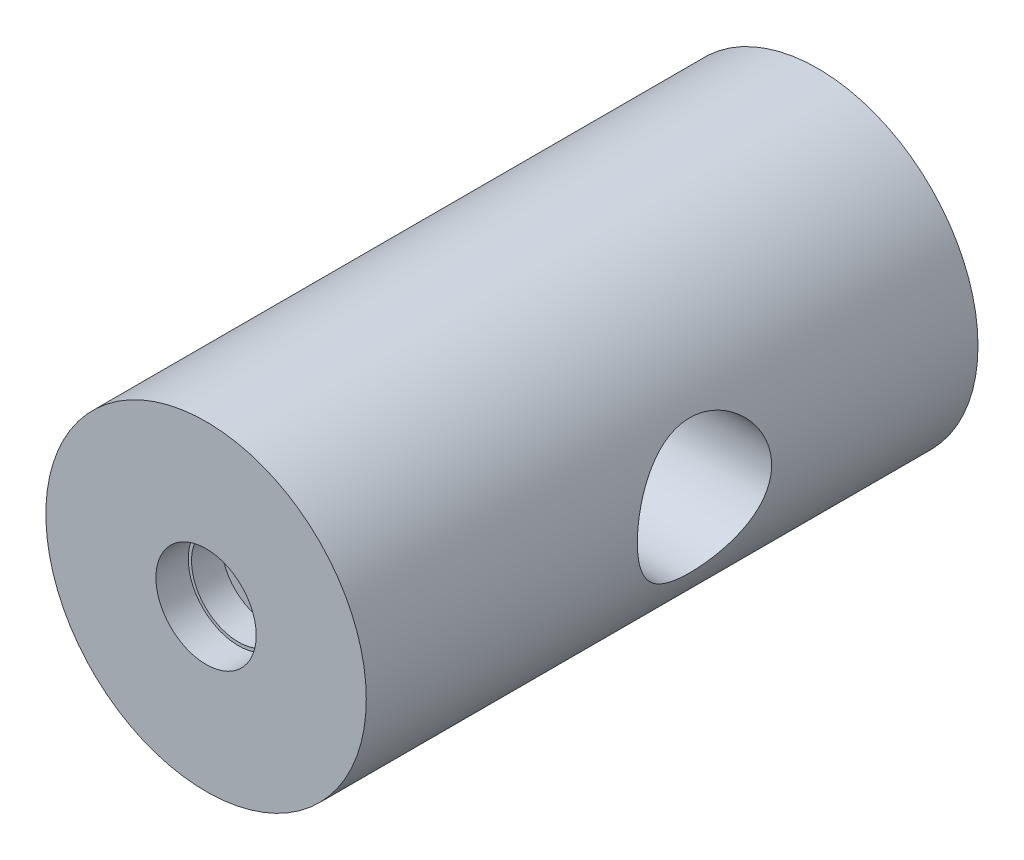
ISO-10303-21;
HEADER;
FILE_DESCRIPTION(('STEP AP214'),'2;1');
FILE_NAME('part.step','',(''),(''),'','','');
FILE_SCHEMA(('AUTOMOTIVE_DESIGN { 1 0 10303 214 1 1 1 1 }'));
ENDSEC;
DATA;
#1=APPLICATION_CONTEXT('core data for automotive mechanical design processes');
#2=APPLICATION_PROTOCOL_DEFINITION('international standard','automotive_design',2000,#1);
#3=PRODUCT_CONTEXT('',#1,'mechanical');
#4=PRODUCT('Part','Part','',(#3));
#5=PRODUCT_RELATED_PRODUCT_CATEGORY('part','',(#4));
#6=PRODUCT_DEFINITION_FORMATION('','',#4);
#7=PRODUCT_DEFINITION_CONTEXT('part definition',#1,'design');
#8=PRODUCT_DEFINITION('design','',#6,#7);
#9=PRODUCT_DEFINITION_SHAPE('','',#8);
#10=(LENGTH_UNIT() NAMED_UNIT(*) SI_UNIT(.MILLI.,.METRE.));
#11=(NAMED_UNIT(*) PLANE_ANGLE_UNIT() SI_UNIT($,.RADIAN.));
#12=(NAMED_UNIT(*) SI_UNIT($,.STERADIAN.) SOLID_ANGLE_UNIT());
#13=UNCERTAINTY_MEASURE_WITH_UNIT(LENGTH_MEASURE(1.E-05),#10,'distance_accuracy_value','');
#14=(GEOMETRIC_REPRESENTATION_CONTEXT(3) GLOBAL_UNCERTAINTY_ASSIGNED_CONTEXT((#13)) GLOBAL_UNIT_ASSIGNED_CONTEXT((#10,
#11,#12)) REPRESENTATION_CONTEXT('',''));
#15=CARTESIAN_POINT('',(0.,0.,0.));
#16=DIRECTION('',(0.,0.,1.));
#17=DIRECTION('',(1.,0.,0.));
#18=AXIS2_PLACEMENT_3D('',#15,#16,#17);
#19=CARTESIAN_POINT('',(0.,0.,29.8));
#20=DIRECTION('',(0.,0.,-1.));
#21=DIRECTION('',(-1.,0.,0.));
#22=AXIS2_PLACEMENT_3D('',#19,#20,#21);
#23=CYLINDRICAL_SURFACE('',#22,9.9);
#24=CARTESIAN_POINT('',(-9.9,0.,12.75));
#25=CARTESIAN_POINT('',(-9.89999936376863,0.111137703961855,12.7500008035311));
#26=CARTESIAN_POINT('',(-9.89812330404278,0.222312493642021,12.754470723063));
#27=CARTESIAN_POINT('',(-9.89066654053828,0.443868040869987,12.7723072014739));
#28=CARTESIAN_POINT('',(-9.88508351262446,0.554248256333967,12.7856793417377));
#29=CARTESIAN_POINT('',(-9.87034270889893,0.773582620903799,12.8212220269499));
#30=CARTESIAN_POINT('',(-9.86117766034859,0.882533399633642,12.8434104735789));
#31=CARTESIAN_POINT('',(-9.83951896356755,1.09801010128795,12.8963508538441));
#32=CARTESIAN_POINT('',(-9.82702395497839,1.20453501384682,12.9271062875066));
#33=CARTESIAN_POINT('',(-9.78510514707102,1.51855909051875,13.0315489067497));
#34=CARTESIAN_POINT('',(-9.75117611287902,1.72150643341442,13.1175769331328));
#35=CARTESIAN_POINT('',(-9.67461014365812,2.10978946162909,13.3195994434313));
#36=CARTESIAN_POINT('',(-9.63197578820685,2.29513034034601,13.4355850529492));
#37=CARTESIAN_POINT('',(-9.53984092867632,2.65274926107655,13.700437991587));
#38=CARTESIAN_POINT('',(-9.49011385120872,2.82402450112796,13.8505796045757));
#39=CARTESIAN_POINT('',(-9.39034773839318,3.13988111638779,14.1769140284446));
#40=CARTESIAN_POINT('',(-9.34030855150487,3.28444827800387,14.3531206213688));
#41=CARTESIAN_POINT('',(-9.26781448340973,3.48179189572314,14.6385959004717));
#42=CARTESIAN_POINT('',(-9.24353570439206,3.54557708556255,14.7399611234836));
#43=CARTESIAN_POINT('',(-9.19710855039205,3.66432162895562,14.9481827821323));
#44=CARTESIAN_POINT('',(-9.17495930812479,3.7192845816522,15.0550369548775));
#45=CARTESIAN_POINT('',(-9.13352324057704,3.81991078551445,15.2735752510797));
#46=CARTESIAN_POINT('',(-9.11423652117129,3.86557369272711,15.3852595529892));
#47=CARTESIAN_POINT('',(-9.07921906414395,3.94711943240492,15.6126294319046));
#48=CARTESIAN_POINT('',(-9.063486491741,3.98300731307548,15.72831290866));
#49=CARTESIAN_POINT('',(-9.03681927940762,4.04313332439531,15.9571894142507));
#50=CARTESIAN_POINT('',(-9.02569015532342,4.0678490336294,16.0702343170837));
#51=CARTESIAN_POINT('',(-9.00758955656416,4.10777466348236,16.2982709508497));
#52=CARTESIAN_POINT('',(-9.00061615358382,4.12298899301464,16.4132617533485));
#53=CARTESIAN_POINT('',(-8.99108372103437,4.14373560752424,16.6442664424728));
#54=CARTESIAN_POINT('',(-8.98852351940748,4.14927046318138,16.7602800492327));
#55=CARTESIAN_POINT('',(-8.98791222396132,4.15059447358503,16.9923698566112));
#56=CARTESIAN_POINT('',(-8.98986088842473,4.14638415076408,17.1084460535408));
#57=CARTESIAN_POINT('',(-8.99786711744624,4.1289794026888,17.3306474109071));
#58=CARTESIAN_POINT('',(-9.00359203187312,4.11651200898724,17.4368419891025));
#59=CARTESIAN_POINT('',(-9.01861910903411,4.0834822341996,17.6477180224297));
#60=CARTESIAN_POINT('',(-9.02792244041163,4.06291720852776,17.7523989716385));
#61=CARTESIAN_POINT('',(-9.06079367522316,3.98935906912969,18.0630561402822));
#62=CARTESIAN_POINT('',(-9.08933016326327,3.92448818062487,18.2658298230904));
#63=CARTESIAN_POINT('',(-9.15708730335573,3.76370078915723,18.6617530716921));
#64=CARTESIAN_POINT('',(-9.19652353854096,3.66714958667136,18.8546037986563));
#65=CARTESIAN_POINT('',(-9.28158889766754,3.44617317987444,19.2221518906887));
#66=CARTESIAN_POINT('',(-9.32722047761662,3.32173690835158,19.3968420076433));
#67=CARTESIAN_POINT('',(-9.42428807223253,3.03602000225575,19.7388173876313));
#68=CARTESIAN_POINT('',(-9.47588651109946,2.87249668888246,19.9041873589521));
#69=CARTESIAN_POINT('',(-9.5757806460006,2.51953247711901,20.2058064187901));
#70=CARTESIAN_POINT('',(-9.62407554771284,2.33008537808745,20.3420485202518));
#71=CARTESIAN_POINT('',(-9.71335444507636,1.92477321640077,20.5843956816636));
#72=CARTESIAN_POINT('',(-9.75413881402709,1.70838985634246,20.6897128978233));
#73=CARTESIAN_POINT('',(-9.82226542388113,1.25883060581747,20.8617774632507));
#74=CARTESIAN_POINT('',(-9.8496151852428,1.02566419421865,20.9285463948526));
#75=CARTESIAN_POINT('',(-9.88638084332872,0.56514987525805,21.0175906009642));
#76=CARTESIAN_POINT('',(-9.89683037211846,0.338381125603339,21.0424347272065));
#77=CARTESIAN_POINT('',(-9.9019242220063,-0.116307819693139,21.0545938655225));
#78=CARTESIAN_POINT('',(-9.89657315114652,-0.344227660280251,21.041919819287));
#79=CARTESIAN_POINT('',(-9.87133634996601,-0.78265923574304,20.9812335866085));
#80=CARTESIAN_POINT('',(-9.85219620628951,-0.993469590094815,20.9350332938313));
#81=CARTESIAN_POINT('',(-9.80210617940928,-1.40411205469761,20.8111357366801));
#82=CARTESIAN_POINT('',(-9.77115480871942,-1.60394277856468,20.7334345050536));
#83=CARTESIAN_POINT('',(-9.69920828576771,-1.99397325594313,20.5462075537138));
#84=CARTESIAN_POINT('',(-9.65793061664588,-2.18367995871516,20.4357669408619));
#85=CARTESIAN_POINT('',(-9.5697248575726,-2.54255162791106,20.187189530803));
#86=CARTESIAN_POINT('',(-9.52279439951565,-2.71170792519428,20.0490411098167));
#87=CARTESIAN_POINT('',(-9.42414598755407,-3.03751747432849,19.7373316035958));
#88=CARTESIAN_POINT('',(-9.37232720704453,-3.19238270766228,19.5619324000595));
#89=CARTESIAN_POINT('',(-9.27274790681631,-3.47103788966408,19.1866861854376));
#90=CARTESIAN_POINT('',(-9.22498835252473,-3.59482045938435,18.9868333858446));
#91=CARTESIAN_POINT('',(-9.16038285117577,-3.75509902997386,18.6708808227953));
#92=CARTESIAN_POINT('',(-9.13988633545232,-3.80458088786905,18.5619380932541));
#93=CARTESIAN_POINT('',(-9.10210570979698,-3.8941025204541,18.3397185282604));
#94=CARTESIAN_POINT('',(-9.08482018391276,-3.93414645909332,18.2264436298678));
#95=CARTESIAN_POINT('',(-9.05409614377175,-4.00434927089742,17.996423585491));
#96=CARTESIAN_POINT('',(-9.04065581944121,-4.03451279609837,17.8796801009581));
#97=CARTESIAN_POINT('',(-9.01812925607071,-4.08461779769234,17.643606991222));
#98=CARTESIAN_POINT('',(-9.0090426004179,-4.10456025217656,17.5242776146115));
#99=CARTESIAN_POINT('',(-8.99611391588451,-4.13281437444869,17.293439337819));
#100=CARTESIAN_POINT('',(-8.99191832926178,-4.14191137957702,17.1820457642068));
#101=CARTESIAN_POINT('',(-8.98768553066504,-4.15108838198007,16.9587693710159));
#102=CARTESIAN_POINT('',(-8.98764970988141,-4.15116536260159,16.8468864002736));
#103=CARTESIAN_POINT('',(-8.99174328753819,-4.1422915427831,16.6236100824451));
#104=CARTESIAN_POINT('',(-8.99587048063969,-4.13334552223979,16.5122165074838));
#105=CARTESIAN_POINT('',(-9.00813306920598,-4.10654866232301,16.290715870196));
#106=CARTESIAN_POINT('',(-9.01626997536347,-4.08869446668885,16.1806093087812));
#107=CARTESIAN_POINT('',(-9.04534745945391,-4.02416855074486,15.8639828562347));
#108=CARTESIAN_POINT('',(-9.07121594656557,-3.96603108540419,15.6601239220676));
#109=CARTESIAN_POINT('',(-9.13356726628056,-3.82023041436249,15.2651357551367));
#110=CARTESIAN_POINT('',(-9.17005308850471,-3.7325588913873,15.0740101264609));
#111=CARTESIAN_POINT('',(-9.25226158677317,-3.52404918447954,14.6971197355741));
#112=CARTESIAN_POINT('',(-9.29840971024954,-3.40152454522612,14.5123798486438));
#113=CARTESIAN_POINT('',(-9.39356616502039,-3.12917510236536,14.1651244538166));
#114=CARTESIAN_POINT('',(-9.44257550316371,-2.97934064871501,14.0026168374364));
#115=CARTESIAN_POINT('',(-9.54231751439895,-2.64328981720729,13.6919530301101));
#116=CARTESIAN_POINT('',(-9.59290880572471,-2.45520030266615,13.5457524389309));
#117=CARTESIAN_POINT('',(-9.66303246643307,-2.15555513434042,13.3517160964985));
#118=CARTESIAN_POINT('',(-9.68546252645347,-2.05266317941709,13.2912087748325));
#119=CARTESIAN_POINT('',(-9.72778786872433,-1.84165436299105,13.1791056315617));
#120=CARTESIAN_POINT('',(-9.74768431937099,-1.73353994183554,13.1275056983038));
#121=CARTESIAN_POINT('',(-9.78408504647997,-1.51453460923357,13.034430736803));
#122=CARTESIAN_POINT('',(-9.80063750375299,-1.40371355473514,12.9928099951081));
#123=CARTESIAN_POINT('',(-9.83025548206077,-1.17854138787132,12.9191002856221));
#124=CARTESIAN_POINT('',(-9.84332265904065,-1.06419198083264,12.8870067903726));
#125=CARTESIAN_POINT('',(-9.86556624445071,-0.833095117524291,12.8327517686785));
#126=CARTESIAN_POINT('',(-9.87475223227463,-0.716354319971054,12.8105657811198));
#127=CARTESIAN_POINT('',(-9.88899838513333,-0.481210524491665,12.7762838815714));
#128=CARTESIAN_POINT('',(-9.89406156409536,-0.36280880529021,12.7641805985985));
#129=CARTESIAN_POINT('',(-9.89799262362366,-0.203468410002861,12.754790701385));
#130=CARTESIAN_POINT('',(-9.89874496694733,-0.162800798814473,12.7529946946562));
#131=CARTESIAN_POINT('',(-9.8997487725532,-0.0814237842268527,12.7505991946813));
#132=CARTESIAN_POINT('',(-9.90000023307812,-0.0407143806814991,12.749999705633));
#133=CARTESIAN_POINT('',(-9.9,0.,12.75));
#134=B_SPLINE_CURVE_WITH_KNOTS('',3,(#24,#25,#26,#27,#28,#29,#30,#31,#32,#33,#34,#35,#36,#37,
#38,#39,#40,#41,#42,#43,#44,#45,#46,#47,#48,#49,#50,#51,#52,#53,#54,#55,#56,#57,#58,#59,#60,#61,
#62,#63,#64,#65,#66,#67,#68,#69,#70,#71,#72,#73,#74,#75,#76,#77,#78,#79,#80,#81,#82,#83,#84,#85,
#86,#87,#88,#89,#90,#91,#92,#93,#94,#95,#96,#97,#98,#99,#100,#101,#102,#103,#104,#105,#106,#107,
#108,#109,#110,#111,#112,#113,#114,#115,#116,#117,#118,#119,#120,#121,#122,#123,#124,#125,#126,
#127,#128,#129,#130,#131,#132,#133),.UNSPECIFIED.,.T.,.F.,(4,2,2,2,2,2,2,2,2,2,2,2,2,2,2,2,2,2,
2,2,2,2,2,2,2,2,2,2,2,2,2,2,2,2,2,2,2,2,2,2,2,2,2,2,2,2,2,2,2,2,2,2,2,2,4),(0.,
0.333371521871553,0.666952253259356,1.00121381684168,1.33561214315506,2.00140288954413,
2.66699663310014,3.36342232235007,4.06021757672445,4.42643531414003,4.79250326658461,
5.1585847552345,5.52447682509167,5.87275805062309,6.22087754333157,6.56890456823175,
6.91691293606631,7.23775297374102,7.55869788080057,8.20004288827763,8.8551133968667,
9.51044435611841,10.2218965610642,10.9335192347933,11.6619503738501,12.3899732838897,
13.0715091618965,13.7528462983431,14.3998690282261,15.0469732699739,15.714209765283,
16.3817267625169,17.0975019755126,17.8134469514746,18.1772335154026,18.5408592773258,
18.9043135849033,19.2677331057279,19.6028286844142,19.9380363320051,20.2730664979806,
20.6082229859723,21.2458303770357,21.8836174790967,22.560012530966,23.2366470549971,
23.9634177448462,24.3274016564359,24.6912171010398,25.0493432510781,25.4072989419561,
25.7643659057268,26.1211716052708,26.2432990826896,26.3654269885757),.UNSPECIFIED.);
#135=CARTESIAN_POINT('',(-9.9,0.,12.75));
#136=VERTEX_POINT('',#135);
#137=EDGE_CURVE('E10',#136,#136,#134,.T.);
#138=ORIENTED_EDGE('',*,*,#137,.T.);
#139=EDGE_LOOP('',(#138));
#140=FACE_BOUND('',#139,.T.);
#141=CARTESIAN_POINT('',(9.89999999999999,0.,12.75));
#142=CARTESIAN_POINT('',(9.89999936376861,-0.111137703961856,12.7500008035311));
#143=CARTESIAN_POINT('',(9.89812330404277,-0.222312493642022,12.754470723063));
#144=CARTESIAN_POINT('',(9.89066654053828,-0.443868040869988,12.7723072014739));
#145=CARTESIAN_POINT('',(9.88508351262446,-0.554248256333968,12.7856793417377));
#146=CARTESIAN_POINT('',(9.87034270889893,-0.7735826209038,12.8212220269499));
#147=CARTESIAN_POINT('',(9.86117766034859,-0.882533399633644,12.8434104735789));
#148=CARTESIAN_POINT('',(9.83951896356755,-1.09801010128795,12.8963508538441));
#149=CARTESIAN_POINT('',(9.82702395497839,-1.20453501384682,12.9271062875066));
#150=CARTESIAN_POINT('',(9.78510514707102,-1.51855909051875,13.0315489067497));
#151=CARTESIAN_POINT('',(9.75117611287902,-1.72150643341443,13.1175769331328));
#152=CARTESIAN_POINT('',(9.67461014365812,-2.10978946162909,13.3195994434313));
#153=CARTESIAN_POINT('',(9.63197578820685,-2.29513034034601,13.4355850529492));
#154=CARTESIAN_POINT('',(9.53984092867632,-2.65274926107655,13.700437991587));
#155=CARTESIAN_POINT('',(9.49011385120871,-2.82402450112797,13.8505796045757));
#156=CARTESIAN_POINT('',(9.39034773839317,-3.13988111638779,14.1769140284447));
#157=CARTESIAN_POINT('',(9.34030855150487,-3.28444827800387,14.3531206213688));
#158=CARTESIAN_POINT('',(9.26781448340973,-3.48179189572314,14.6385959004717));
#159=CARTESIAN_POINT('',(9.24353570439206,-3.54557708556255,14.7399611234836));
#160=CARTESIAN_POINT('',(9.19710855039205,-3.66432162895563,14.9481827821323));
#161=CARTESIAN_POINT('',(9.17495930812479,-3.7192845816522,15.0550369548775));
#162=CARTESIAN_POINT('',(9.13352324057704,-3.81991078551446,15.2735752510797));
#163=CARTESIAN_POINT('',(9.11423652117128,-3.86557369272711,15.3852595529892));
#164=CARTESIAN_POINT('',(9.07921906414395,-3.94711943240492,15.6126294319046));
#165=CARTESIAN_POINT('',(9.063486491741,-3.98300731307548,15.72831290866));
#166=CARTESIAN_POINT('',(9.03681927940762,-4.04313332439531,15.9571894142507));
#167=CARTESIAN_POINT('',(9.02569015532341,-4.0678490336294,16.0702343170837));
#168=CARTESIAN_POINT('',(9.00758955656416,-4.10777466348236,16.2982709508497));
#169=CARTESIAN_POINT('',(9.00061615358382,-4.12298899301464,16.4132617533485));
#170=CARTESIAN_POINT('',(8.99108372103437,-4.14373560752424,16.6442664424728));
#171=CARTESIAN_POINT('',(8.98852351940748,-4.14927046318138,16.7602800492327));
#172=CARTESIAN_POINT('',(8.98791222396132,-4.15059447358503,16.9923698566112));
#173=CARTESIAN_POINT('',(8.98986088842473,-4.14638415076408,17.1084460535408));
#174=CARTESIAN_POINT('',(8.99786711744624,-4.1289794026888,17.3306474109071));
#175=CARTESIAN_POINT('',(9.00359203187312,-4.11651200898724,17.4368419891025));
#176=CARTESIAN_POINT('',(9.01861910903411,-4.0834822341996,17.6477180224297));
#177=CARTESIAN_POINT('',(9.02792244041163,-4.06291720852776,17.7523989716385));
#178=CARTESIAN_POINT('',(9.06079367522316,-3.98935906912969,18.0630561402822));
#179=CARTESIAN_POINT('',(9.08933016326327,-3.92448818062488,18.2658298230904));
#180=CARTESIAN_POINT('',(9.15708730335573,-3.76370078915723,18.6617530716921));
#181=CARTESIAN_POINT('',(9.19652353854096,-3.66714958667136,18.8546037986563));
#182=CARTESIAN_POINT('',(9.28158889766754,-3.44617317987444,19.2221518906887));
#183=CARTESIAN_POINT('',(9.32722047761662,-3.32173690835158,19.3968420076433));
#184=CARTESIAN_POINT('',(9.42428807223253,-3.03602000225575,19.7388173876313));
#185=CARTESIAN_POINT('',(9.47588651109946,-2.87249668888246,19.9041873589521));
#186=CARTESIAN_POINT('',(9.5757806460006,-2.51953247711901,20.2058064187901));
#187=CARTESIAN_POINT('',(9.62407554771284,-2.33008537808745,20.3420485202518));
#188=CARTESIAN_POINT('',(9.71335444507636,-1.92477321640077,20.5843956816636));
#189=CARTESIAN_POINT('',(9.75413881402709,-1.70838985634246,20.6897128978233));
#190=CARTESIAN_POINT('',(9.82226542388113,-1.25883060581747,20.8617774632507));
#191=CARTESIAN_POINT('',(9.8496151852428,-1.02566419421864,20.9285463948526));
#192=CARTESIAN_POINT('',(9.88638084332872,-0.565149875258049,21.0175906009642));
#193=CARTESIAN_POINT('',(9.89683037211846,-0.338381125603338,21.0424347272065));
#194=CARTESIAN_POINT('',(9.9019242220063,0.116307819693141,21.0545938655225));
#195=CARTESIAN_POINT('',(9.89657315114652,0.344227660280253,21.041919819287));
#196=CARTESIAN_POINT('',(9.87133634996601,0.782659235743042,20.9812335866085));
#197=CARTESIAN_POINT('',(9.85219620628951,0.993469590094818,20.9350332938313));
#198=CARTESIAN_POINT('',(9.80210617940928,1.40411205469761,20.8111357366801));
#199=CARTESIAN_POINT('',(9.77115480871942,1.60394277856468,20.7334345050536));
#200=CARTESIAN_POINT('',(9.69920828576771,1.99397325594313,20.5462075537138));
#201=CARTESIAN_POINT('',(9.65793061664588,2.18367995871516,20.4357669408619));
#202=CARTESIAN_POINT('',(9.5697248575726,2.54255162791107,20.187189530803));
#203=CARTESIAN_POINT('',(9.52279439951565,2.71170792519428,20.0490411098167));
#204=CARTESIAN_POINT('',(9.42414598755407,3.03751747432849,19.7373316035958));
#205=CARTESIAN_POINT('',(9.37232720704453,3.19238270766228,19.5619324000595));
#206=CARTESIAN_POINT('',(9.27274790681631,3.47103788966408,19.1866861854376));
#207=CARTESIAN_POINT('',(9.22498835252473,3.59482045938436,18.9868333858446));
#208=CARTESIAN_POINT('',(9.16038285117577,3.75509902997386,18.6708808227953));
#209=CARTESIAN_POINT('',(9.13988633545232,3.80458088786905,18.5619380932541));
#210=CARTESIAN_POINT('',(9.10210570979698,3.8941025204541,18.3397185282604));
#211=CARTESIAN_POINT('',(9.08482018391276,3.93414645909332,18.2264436298678));
#212=CARTESIAN_POINT('',(9.05409614377175,4.00434927089742,17.996423585491));
#213=CARTESIAN_POINT('',(9.0406558194412,4.03451279609837,17.8796801009581));
#214=CARTESIAN_POINT('',(9.01812925607071,4.08461779769234,17.643606991222));
#215=CARTESIAN_POINT('',(9.0090426004179,4.10456025217656,17.5242776146115));
#216=CARTESIAN_POINT('',(8.99611391588451,4.13281437444869,17.293439337819));
#217=CARTESIAN_POINT('',(8.99191832926178,4.14191137957702,17.1820457642068));
#218=CARTESIAN_POINT('',(8.98768553066504,4.15108838198007,16.9587693710159));
#219=CARTESIAN_POINT('',(8.98764970988141,4.15116536260159,16.8468864002736));
#220=CARTESIAN_POINT('',(8.99174328753819,4.1422915427831,16.6236100824451));
#221=CARTESIAN_POINT('',(8.99587048063969,4.13334552223979,16.5122165074838));
#222=CARTESIAN_POINT('',(9.00813306920598,4.10654866232301,16.290715870196));
#223=CARTESIAN_POINT('',(9.01626997536347,4.08869446668884,16.1806093087812));
#224=CARTESIAN_POINT('',(9.04534745945391,4.02416855074486,15.8639828562347));
#225=CARTESIAN_POINT('',(9.07121594656557,3.96603108540419,15.6601239220676));
#226=CARTESIAN_POINT('',(9.13356726628056,3.82023041436249,15.2651357551367));
#227=CARTESIAN_POINT('',(9.17005308850471,3.7325588913873,15.0740101264609));
#228=CARTESIAN_POINT('',(9.25226158677317,3.52404918447954,14.6971197355741));
#229=CARTESIAN_POINT('',(9.29840971024954,3.40152454522612,14.5123798486438));
#230=CARTESIAN_POINT('',(9.39356616502039,3.12917510236536,14.1651244538165));
#231=CARTESIAN_POINT('',(9.44257550316371,2.979340648715,14.0026168374364));
#232=CARTESIAN_POINT('',(9.54231751439895,2.64328981720729,13.6919530301101));
#233=CARTESIAN_POINT('',(9.59290880572471,2.45520030266614,13.5457524389308));
#234=CARTESIAN_POINT('',(9.66303246643307,2.15555513434041,13.3517160964985));
#235=CARTESIAN_POINT('',(9.68546252645347,2.05266317941708,13.2912087748325));
#236=CARTESIAN_POINT('',(9.72778786872433,1.84165436299104,13.1791056315617));
#237=CARTESIAN_POINT('',(9.74768431937099,1.73353994183553,13.1275056983038));
#238=CARTESIAN_POINT('',(9.78408504647997,1.51453460923357,13.034430736803));
#239=CARTESIAN_POINT('',(9.80063750375299,1.40371355473514,12.9928099951081));
#240=CARTESIAN_POINT('',(9.83025548206077,1.17854138787131,12.9191002856221));
#241=CARTESIAN_POINT('',(9.84332265904065,1.06419198083264,12.8870067903726));
#242=CARTESIAN_POINT('',(9.86556624445071,0.833095117524287,12.8327517686785));
#243=CARTESIAN_POINT('',(9.87475223227463,0.71635431997105,12.8105657811198));
#244=CARTESIAN_POINT('',(9.88899838513333,0.481210524491663,12.7762838815714));
#245=CARTESIAN_POINT('',(9.89406156409536,0.362808805290207,12.7641805985985));
#246=CARTESIAN_POINT('',(9.89799262362366,0.203468410002857,12.754790701385));
#247=CARTESIAN_POINT('',(9.89874496694733,0.162800798814469,12.7529946946562));
#248=CARTESIAN_POINT('',(9.8997487725532,0.0814237842268505,12.7505991946813));
#249=CARTESIAN_POINT('',(9.90000023307811,0.040714380681498,12.749999705633));
#250=CARTESIAN_POINT('',(9.89999999999999,0.,12.75));
#251=B_SPLINE_CURVE_WITH_KNOTS('',3,(#141,#142,#143,#144,#145,#146,#147,#148,#149,#150,#151,
#152,#153,#154,#155,#156,#157,#158,#159,#160,#161,#162,#163,#164,#165,#166,#167,#168,#169,#170,
#171,#172,#173,#174,#175,#176,#177,#178,#179,#180,#181,#182,#183,#184,#185,#186,#187,#188,#189,
#190,#191,#192,#193,#194,#195,#196,#197,#198,#199,#200,#201,#202,#203,#204,#205,#206,#207,#208,
#209,#210,#211,#212,#213,#214,#215,#216,#217,#218,#219,#220,#221,#222,#223,#224,#225,#226,#227,
#228,#229,#230,#231,#232,#233,#234,#235,#236,#237,#238,#239,#240,#241,#242,#243,#244,#245,#246,
#247,#248,#249,#250),.UNSPECIFIED.,.T.,.F.,(4,2,2,2,2,2,2,2,2,2,2,2,2,2,2,2,2,2,2,2,2,2,2,2,2,2,
2,2,2,2,2,2,2,2,2,2,2,2,2,2,2,2,2,2,2,2,2,2,2,2,2,2,2,2,4),(0.,0.333371521871554,
0.666952253259358,1.00121381684169,1.33561214315506,2.00140288954413,2.66699663310014,
3.36342232235007,4.06021757672445,4.42643531414004,4.79250326658462,5.1585847552345,
5.52447682509167,5.87275805062309,6.22087754333157,6.56890456823175,6.91691293606632,
7.23775297374102,7.55869788080057,8.20004288827764,8.8551133968667,9.51044435611841,
10.2218965610642,10.9335192347933,11.6619503738501,12.3899732838897,13.0715091618965,
13.7528462983431,14.3998690282261,15.0469732699739,15.714209765283,16.3817267625169,
17.0975019755126,17.8134469514746,18.1772335154026,18.5408592773258,18.9043135849033,
19.2677331057279,19.6028286844142,19.9380363320052,20.2730664979806,20.6082229859723,
21.2458303770357,21.8836174790967,22.560012530966,23.2366470549971,23.9634177448462,
24.3274016564359,24.6912171010398,25.0493432510781,25.4072989419561,25.7643659057268,
26.1211716052708,26.2432990826896,26.3654269885757),.UNSPECIFIED.);
#252=CARTESIAN_POINT('',(9.89999999999999,0.,12.75));
#253=VERTEX_POINT('',#252);
#254=EDGE_CURVE('E46',#253,#253,#251,.T.);
#255=ORIENTED_EDGE('',*,*,#254,.T.);
#256=EDGE_LOOP('',(#255));
#257=FACE_BOUND('',#256,.T.);
#258=CARTESIAN_POINT('',(0.,0.,0.));
#259=DIRECTION('',(0.,0.,1.));
#260=DIRECTION('',(1.,0.,0.));
#261=AXIS2_PLACEMENT_3D('',#258,#259,#260);
#262=CIRCLE('',#261,9.9);
#263=CARTESIAN_POINT('',(9.9,0.,0.));
#264=VERTEX_POINT('',#263);
#265=EDGE_CURVE('E50',#264,#264,#262,.T.);
#266=ORIENTED_EDGE('',*,*,#265,.T.);
#267=EDGE_LOOP('',(#266));
#268=FACE_BOUND('',#267,.T.);
#269=CARTESIAN_POINT('',(0.,0.,37.8));
#270=DIRECTION('',(0.,0.,1.));
#271=DIRECTION('',(1.,0.,0.));
#272=AXIS2_PLACEMENT_3D('',#269,#270,#271);
#273=CIRCLE('',#272,9.9);
#274=CARTESIAN_POINT('',(9.9,0.,37.8));
#275=VERTEX_POINT('',#274);
#276=EDGE_CURVE('E54',#275,#275,#273,.T.);
#277=ORIENTED_EDGE('',*,*,#276,.F.);
#278=EDGE_LOOP('',(#277));
#279=FACE_BOUND('',#278,.T.);
#280=ADVANCED_FACE('F35',(#140,#257,#268,#279),#23,.T.);
#281=CARTESIAN_POINT('',(0.,0.,0.));
#282=DIRECTION('',(0.,0.,1.));
#283=DIRECTION('',(1.,0.,0.));
#284=AXIS2_PLACEMENT_3D('',#281,#282,#283);
#285=PLANE('',#284);
#286=ORIENTED_EDGE('',*,*,#265,.F.);
#287=EDGE_LOOP('',(#286));
#288=FACE_BOUND('',#287,.T.);
#289=ADVANCED_FACE('F65',(#288),#285,.F.);
#290=CARTESIAN_POINT('',(-9.9,0.,16.9));
#291=DIRECTION('',(1.,0.,0.));
#292=DIRECTION('',(0.,0.,-1.));
#293=AXIS2_PLACEMENT_3D('',#290,#291,#292);
#294=CYLINDRICAL_SURFACE('',#293,4.15);
#295=ORIENTED_EDGE('',*,*,#254,.F.);
#296=EDGE_LOOP('',(#295));
#297=FACE_BOUND('',#296,.T.);
#298=ORIENTED_EDGE('',*,*,#137,.F.);
#299=EDGE_LOOP('',(#298));
#300=FACE_BOUND('',#299,.T.);
#301=ADVANCED_FACE('F60',(#297,#300),#294,.F.);
#302=CARTESIAN_POINT('',(0.,0.,37.8));
#303=DIRECTION('',(0.,0.,1.));
#304=DIRECTION('',(1.,0.,0.));
#305=AXIS2_PLACEMENT_3D('',#302,#303,#304);
#306=PLANE('',#305);
#307=CARTESIAN_POINT('',(0.,0.,37.8));
#308=DIRECTION('',(0.,0.,1.));
#309=DIRECTION('',(1.,0.,0.));
#310=AXIS2_PLACEMENT_3D('',#307,#308,#309);
#311=CIRCLE('',#310,3.1);
#312=CARTESIAN_POINT('',(3.1,0.,37.8));
#313=VERTEX_POINT('',#312);
#314=EDGE_CURVE('E82',#313,#313,#311,.T.);
#315=ORIENTED_EDGE('',*,*,#314,.F.);
#316=EDGE_LOOP('',(#315));
#317=FACE_BOUND('',#316,.T.);
#318=ORIENTED_EDGE('',*,*,#276,.T.);
#319=EDGE_LOOP('',(#318));
#320=FACE_BOUND('',#319,.T.);
#321=ADVANCED_FACE('F64',(#317,#320),#306,.T.);
#322=CARTESIAN_POINT('',(0.,0.,35.8));
#323=DIRECTION('',(0.,0.,1.));
#324=DIRECTION('',(1.,0.,0.));
#325=AXIS2_PLACEMENT_3D('',#322,#323,#324);
#326=CYLINDRICAL_SURFACE('',#325,3.1);
#327=CARTESIAN_POINT('',(0.,0.,35.8));
#328=DIRECTION('',(0.,0.,1.));
#329=DIRECTION('',(1.,0.,0.));
#330=AXIS2_PLACEMENT_3D('',#327,#328,#329);
#331=CIRCLE('',#330,3.1);
#332=CARTESIAN_POINT('',(3.1,0.,35.8));
#333=VERTEX_POINT('',#332);
#334=EDGE_CURVE('E80',#333,#333,#331,.T.);
#335=ORIENTED_EDGE('',*,*,#334,.F.);
#336=EDGE_LOOP('',(#335));
#337=FACE_BOUND('',#336,.T.);
#338=ORIENTED_EDGE('',*,*,#314,.T.);
#339=EDGE_LOOP('',(#338));
#340=FACE_BOUND('',#339,.T.);
#341=ADVANCED_FACE('F123',(#337,#340),#326,.F.);
#342=CARTESIAN_POINT('',(0.,0.,35.8));
#343=DIRECTION('',(0.,0.,1.));
#344=DIRECTION('',(1.,0.,0.));
#345=AXIS2_PLACEMENT_3D('',#342,#343,#344);
#346=PLANE('',#345);
#347=CARTESIAN_POINT('',(0.,0.,35.8));
#348=DIRECTION('',(0.,0.,1.));
#349=DIRECTION('',(1.,0.,0.));
#350=AXIS2_PLACEMENT_3D('',#347,#348,#349);
#351=CIRCLE('',#350,2.9);
#352=CARTESIAN_POINT('',(2.9,0.,35.8));
#353=VERTEX_POINT('',#352);
#354=EDGE_CURVE('E88',#353,#353,#351,.T.);
#355=ORIENTED_EDGE('',*,*,#354,.F.);
#356=EDGE_LOOP('',(#355));
#357=FACE_BOUND('',#356,.T.);
#358=ORIENTED_EDGE('',*,*,#334,.T.);
#359=EDGE_LOOP('',(#358));
#360=FACE_BOUND('',#359,.T.);
#361=ADVANCED_FACE('F117',(#357,#360),#346,.T.);
#362=CARTESIAN_POINT('',(0.,0.,33.95));
#363=DIRECTION('',(0.,0.,1.));
#364=DIRECTION('',(1.,0.,0.));
#365=AXIS2_PLACEMENT_3D('',#362,#363,#364);
#366=CYLINDRICAL_SURFACE('',#365,2.9);
#367=CARTESIAN_POINT('',(0.,0.,33.95));
#368=DIRECTION('',(0.,0.,1.));
#369=DIRECTION('',(1.,0.,0.));
#370=AXIS2_PLACEMENT_3D('',#367,#368,#369);
#371=CIRCLE('',#370,2.9);
#372=CARTESIAN_POINT('',(2.9,0.,33.95));
#373=VERTEX_POINT('',#372);
#374=EDGE_CURVE('E86',#373,#373,#371,.T.);
#375=ORIENTED_EDGE('',*,*,#374,.F.);
#376=EDGE_LOOP('',(#375));
#377=FACE_BOUND('',#376,.T.);
#378=ORIENTED_EDGE('',*,*,#354,.T.);
#379=EDGE_LOOP('',(#378));
#380=FACE_BOUND('',#379,.T.);
#381=ADVANCED_FACE('F111',(#377,#380),#366,.F.);
#382=CARTESIAN_POINT('',(0.,0.,33.95));
#383=DIRECTION('',(0.,0.,1.));
#384=DIRECTION('',(1.,0.,0.));
#385=AXIS2_PLACEMENT_3D('',#382,#383,#384);
#386=PLANE('',#385);
#387=CARTESIAN_POINT('',(0.,0.,33.95));
#388=DIRECTION('',(0.,0.,1.));
#389=DIRECTION('',(1.,0.,0.));
#390=AXIS2_PLACEMENT_3D('',#387,#388,#389);
#391=CIRCLE('',#390,1.25);
#392=CARTESIAN_POINT('',(1.25,0.,33.95));
#393=VERTEX_POINT('',#392);
#394=EDGE_CURVE('E94',#393,#393,#391,.T.);
#395=ORIENTED_EDGE('',*,*,#394,.F.);
#396=EDGE_LOOP('',(#395));
#397=FACE_BOUND('',#396,.T.);
#398=ORIENTED_EDGE('',*,*,#374,.T.);
#399=EDGE_LOOP('',(#398));
#400=FACE_BOUND('',#399,.T.);
#401=ADVANCED_FACE('F105',(#397,#400),#386,.T.);
#402=CARTESIAN_POINT('',(0.,0.,23.95));
#403=DIRECTION('',(0.,0.,1.));
#404=DIRECTION('',(1.,0.,0.));
#405=AXIS2_PLACEMENT_3D('',#402,#403,#404);
#406=CYLINDRICAL_SURFACE('',#405,1.25);
#407=CARTESIAN_POINT('',(0.,0.,23.95));
#408=DIRECTION('',(0.,0.,1.));
#409=DIRECTION('',(1.,0.,0.));
#410=AXIS2_PLACEMENT_3D('',#407,#408,#409);
#411=CIRCLE('',#410,1.25);
#412=CARTESIAN_POINT('',(1.25,0.,23.95));
#413=VERTEX_POINT('',#412);
#414=EDGE_CURVE('E91',#413,#413,#411,.T.);
#415=ORIENTED_EDGE('',*,*,#414,.F.);
#416=EDGE_LOOP('',(#415));
#417=FACE_BOUND('',#416,.T.);
#418=ORIENTED_EDGE('',*,*,#394,.T.);
#419=EDGE_LOOP('',(#418));
#420=FACE_BOUND('',#419,.T.);
#421=ADVANCED_FACE('F102',(#417,#420),#406,.F.);
#422=CARTESIAN_POINT('',(0.,0.,23.95));
#423=DIRECTION('',(0.,0.,1.));
#424=DIRECTION('',(1.,0.,0.));
#425=AXIS2_PLACEMENT_3D('',#422,#423,#424);
#426=PLANE('',#425);
#427=ORIENTED_EDGE('',*,*,#414,.T.);
#428=EDGE_LOOP('',(#427));
#429=FACE_BOUND('',#428,.T.);
#430=ADVANCED_FACE('F100',(#429),#426,.T.);
#431=CLOSED_SHELL('',(#280,#289,#301,#321,#341,#361,#381,#401,#421,#430));
#432=MANIFOLD_SOLID_BREP('B2',#431);
#433=ADVANCED_BREP_SHAPE_REPRESENTATION('',(#18,#432),#14);
#434=SHAPE_DEFINITION_REPRESENTATION(#9,#433);
ENDSEC;
END-ISO-10303-21;
